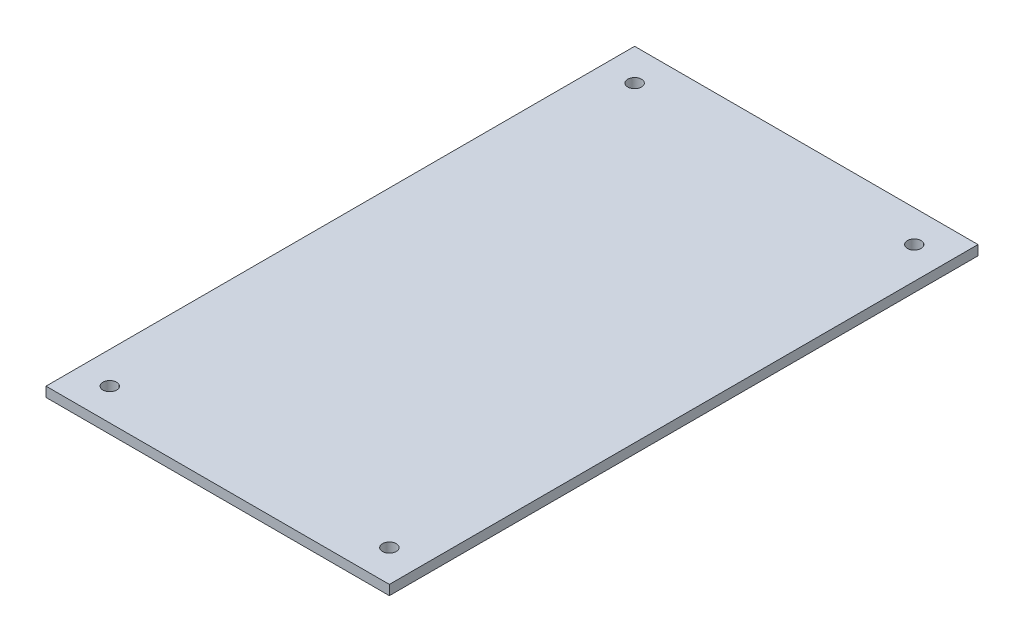
ISO-10303-21;
HEADER;
FILE_DESCRIPTION(('STEP AP214'),'2;1');
FILE_NAME('part.step','',(''),(''),'','','');
FILE_SCHEMA(('AUTOMOTIVE_DESIGN { 1 0 10303 214 1 1 1 1 }'));
ENDSEC;
DATA;
#1=APPLICATION_CONTEXT('core data for automotive mechanical design processes');
#2=APPLICATION_PROTOCOL_DEFINITION('international standard','automotive_design',2000,#1);
#3=PRODUCT_CONTEXT('',#1,'mechanical');
#4=PRODUCT('Part','Part','',(#3));
#5=PRODUCT_RELATED_PRODUCT_CATEGORY('part','',(#4));
#6=PRODUCT_DEFINITION_FORMATION('','',#4);
#7=PRODUCT_DEFINITION_CONTEXT('part definition',#1,'design');
#8=PRODUCT_DEFINITION('design','',#6,#7);
#9=PRODUCT_DEFINITION_SHAPE('','',#8);
#10=(LENGTH_UNIT() NAMED_UNIT(*) SI_UNIT(.MILLI.,.METRE.));
#11=(NAMED_UNIT(*) PLANE_ANGLE_UNIT() SI_UNIT($,.RADIAN.));
#12=(NAMED_UNIT(*) SI_UNIT($,.STERADIAN.) SOLID_ANGLE_UNIT());
#13=UNCERTAINTY_MEASURE_WITH_UNIT(LENGTH_MEASURE(1.E-05),#10,'distance_accuracy_value','');
#14=(GEOMETRIC_REPRESENTATION_CONTEXT(3) GLOBAL_UNCERTAINTY_ASSIGNED_CONTEXT((#13)) GLOBAL_UNIT_ASSIGNED_CONTEXT((#10,
#11,#12)) REPRESENTATION_CONTEXT('',''));
#15=CARTESIAN_POINT('',(0.,0.,0.));
#16=DIRECTION('',(0.,0.,1.));
#17=DIRECTION('',(1.,0.,0.));
#18=AXIS2_PLACEMENT_3D('',#15,#16,#17);
#19=CARTESIAN_POINT('',(-32.,2.,57.));
#20=DIRECTION('',(1.,0.,0.));
#21=DIRECTION('',(0.,0.,-1.));
#22=AXIS2_PLACEMENT_3D('',#19,#20,#21);
#23=PLANE('',#22);
#24=DIRECTION('',(0.,0.,1.));
#25=VECTOR('',#24,1.);
#26=CARTESIAN_POINT('',(-32.,0.,57.));
#27=LINE('',#26,#25);
#28=CARTESIAN_POINT('',(-32.,0.,-57.));
#29=VERTEX_POINT('',#28);
#30=CARTESIAN_POINT('',(-32.,0.,57.));
#31=VERTEX_POINT('',#30);
#32=EDGE_CURVE('E132',#29,#31,#27,.T.);
#33=ORIENTED_EDGE('',*,*,#32,.T.);
#34=DIRECTION('',(0.,-1.,0.));
#35=VECTOR('',#34,1.);
#36=CARTESIAN_POINT('',(-32.,2.,57.));
#37=LINE('',#36,#35);
#38=CARTESIAN_POINT('',(-32.,2.,57.));
#39=VERTEX_POINT('',#38);
#40=EDGE_CURVE('E11',#39,#31,#37,.T.);
#41=ORIENTED_EDGE('',*,*,#40,.F.);
#42=DIRECTION('',(0.,0.,1.));
#43=VECTOR('',#42,1.);
#44=CARTESIAN_POINT('',(-32.,2.,57.));
#45=LINE('',#44,#43);
#46=CARTESIAN_POINT('',(-32.,2.,-57.));
#47=VERTEX_POINT('',#46);
#48=EDGE_CURVE('E141',#47,#39,#45,.T.);
#49=ORIENTED_EDGE('',*,*,#48,.F.);
#50=DIRECTION('',(0.,-1.,0.));
#51=VECTOR('',#50,1.);
#52=CARTESIAN_POINT('',(-32.,2.,-57.));
#53=LINE('',#52,#51);
#54=EDGE_CURVE('E150',#47,#29,#53,.T.);
#55=ORIENTED_EDGE('',*,*,#54,.T.);
#56=EDGE_LOOP('',(#33,#41,#49,#55));
#57=FACE_BOUND('',#56,.T.);
#58=ADVANCED_FACE('F34',(#57),#23,.F.);
#59=CARTESIAN_POINT('',(32.,2.,57.));
#60=DIRECTION('',(0.,0.,-1.));
#61=DIRECTION('',(-1.,0.,0.));
#62=AXIS2_PLACEMENT_3D('',#59,#60,#61);
#63=PLANE('',#62);
#64=DIRECTION('',(1.,0.,0.));
#65=VECTOR('',#64,1.);
#66=CARTESIAN_POINT('',(32.,0.,57.));
#67=LINE('',#66,#65);
#68=CARTESIAN_POINT('',(32.,0.,57.));
#69=VERTEX_POINT('',#68);
#70=EDGE_CURVE('E135',#31,#69,#67,.T.);
#71=ORIENTED_EDGE('',*,*,#70,.T.);
#72=DIRECTION('',(0.,-1.,0.));
#73=VECTOR('',#72,1.);
#74=CARTESIAN_POINT('',(32.,2.,57.));
#75=LINE('',#74,#73);
#76=CARTESIAN_POINT('',(32.,2.,57.));
#77=VERTEX_POINT('',#76);
#78=EDGE_CURVE('E42',#77,#69,#75,.T.);
#79=ORIENTED_EDGE('',*,*,#78,.F.);
#80=DIRECTION('',(1.,0.,0.));
#81=VECTOR('',#80,1.);
#82=CARTESIAN_POINT('',(32.,2.,57.));
#83=LINE('',#82,#81);
#84=EDGE_CURVE('E76',#39,#77,#83,.T.);
#85=ORIENTED_EDGE('',*,*,#84,.F.);
#86=ORIENTED_EDGE('',*,*,#40,.T.);
#87=EDGE_LOOP('',(#71,#79,#85,#86));
#88=FACE_BOUND('',#87,.T.);
#89=ADVANCED_FACE('F177',(#88),#63,.F.);
#90=CARTESIAN_POINT('',(32.,2.,57.));
#91=DIRECTION('',(-1.,0.,0.));
#92=DIRECTION('',(0.,0.,1.));
#93=AXIS2_PLACEMENT_3D('',#90,#91,#92);
#94=PLANE('',#93);
#95=DIRECTION('',(0.,0.,-1.));
#96=VECTOR('',#95,1.);
#97=CARTESIAN_POINT('',(32.,0.,57.));
#98=LINE('',#97,#96);
#99=CARTESIAN_POINT('',(32.,0.,-57.));
#100=VERTEX_POINT('',#99);
#101=EDGE_CURVE('E66',#69,#100,#98,.T.);
#102=ORIENTED_EDGE('',*,*,#101,.T.);
#103=DIRECTION('',(0.,-1.,0.));
#104=VECTOR('',#103,1.);
#105=CARTESIAN_POINT('',(32.,2.,-57.));
#106=LINE('',#105,#104);
#107=CARTESIAN_POINT('',(32.,2.,-57.));
#108=VERTEX_POINT('',#107);
#109=EDGE_CURVE('E50',#108,#100,#106,.T.);
#110=ORIENTED_EDGE('',*,*,#109,.F.);
#111=DIRECTION('',(0.,0.,-1.));
#112=VECTOR('',#111,1.);
#113=CARTESIAN_POINT('',(32.,2.,57.));
#114=LINE('',#113,#112);
#115=EDGE_CURVE('E145',#77,#108,#114,.T.);
#116=ORIENTED_EDGE('',*,*,#115,.F.);
#117=ORIENTED_EDGE('',*,*,#78,.T.);
#118=EDGE_LOOP('',(#102,#110,#116,#117));
#119=FACE_BOUND('',#118,.T.);
#120=ADVANCED_FACE('F156',(#119),#94,.F.);
#121=CARTESIAN_POINT('',(32.,2.,-57.));
#122=DIRECTION('',(0.,0.,1.));
#123=DIRECTION('',(1.,0.,0.));
#124=AXIS2_PLACEMENT_3D('',#121,#122,#123);
#125=PLANE('',#124);
#126=DIRECTION('',(-1.,0.,0.));
#127=VECTOR('',#126,1.);
#128=CARTESIAN_POINT('',(32.,0.,-57.));
#129=LINE('',#128,#127);
#130=EDGE_CURVE('E71',#100,#29,#129,.T.);
#131=ORIENTED_EDGE('',*,*,#130,.T.);
#132=ORIENTED_EDGE('',*,*,#54,.F.);
#133=DIRECTION('',(-1.,0.,0.));
#134=VECTOR('',#133,1.);
#135=CARTESIAN_POINT('',(32.,2.,-57.));
#136=LINE('',#135,#134);
#137=EDGE_CURVE('E148',#108,#47,#136,.T.);
#138=ORIENTED_EDGE('',*,*,#137,.F.);
#139=ORIENTED_EDGE('',*,*,#109,.T.);
#140=EDGE_LOOP('',(#131,#132,#138,#139));
#141=FACE_BOUND('',#140,.T.);
#142=ADVANCED_FACE('F161',(#141),#125,.F.);
#143=CARTESIAN_POINT('',(0.,0.,0.));
#144=DIRECTION('',(0.,1.,0.));
#145=DIRECTION('',(0.,0.,1.));
#146=AXIS2_PLACEMENT_3D('',#143,#144,#145);
#147=PLANE('',#146);
#148=CARTESIAN_POINT('',(28.5,0.,53.5));
#149=DIRECTION('',(0.,1.,0.));
#150=DIRECTION('',(0.,0.,1.));
#151=AXIS2_PLACEMENT_3D('',#148,#149,#150);
#152=CIRCLE('',#151,1.4);
#153=CARTESIAN_POINT('',(28.5,0.,54.9));
#154=VERTEX_POINT('',#153);
#155=EDGE_CURVE('E232',#154,#154,#152,.T.);
#156=ORIENTED_EDGE('',*,*,#155,.T.);
#157=EDGE_LOOP('',(#156));
#158=FACE_BOUND('',#157,.T.);
#159=CARTESIAN_POINT('',(-28.5,0.,53.5));
#160=DIRECTION('',(0.,1.,0.));
#161=DIRECTION('',(0.,0.,1.));
#162=AXIS2_PLACEMENT_3D('',#159,#160,#161);
#163=CIRCLE('',#162,1.4);
#164=CARTESIAN_POINT('',(-28.5,0.,54.9));
#165=VERTEX_POINT('',#164);
#166=EDGE_CURVE('E226',#165,#165,#163,.T.);
#167=ORIENTED_EDGE('',*,*,#166,.T.);
#168=EDGE_LOOP('',(#167));
#169=FACE_BOUND('',#168,.T.);
#170=CARTESIAN_POINT('',(28.5,0.,-53.5));
#171=DIRECTION('',(0.,1.,0.));
#172=DIRECTION('',(0.,0.,1.));
#173=AXIS2_PLACEMENT_3D('',#170,#171,#172);
#174=CIRCLE('',#173,1.4);
#175=CARTESIAN_POINT('',(28.5,0.,-52.1));
#176=VERTEX_POINT('',#175);
#177=EDGE_CURVE('E221',#176,#176,#174,.T.);
#178=ORIENTED_EDGE('',*,*,#177,.T.);
#179=EDGE_LOOP('',(#178));
#180=FACE_BOUND('',#179,.T.);
#181=CARTESIAN_POINT('',(-28.5,0.,-53.5));
#182=DIRECTION('',(0.,1.,0.));
#183=DIRECTION('',(0.,0.,1.));
#184=AXIS2_PLACEMENT_3D('',#181,#182,#183);
#185=CIRCLE('',#184,1.4);
#186=CARTESIAN_POINT('',(-28.5,0.,-52.1));
#187=VERTEX_POINT('',#186);
#188=EDGE_CURVE('E210',#187,#187,#185,.T.);
#189=ORIENTED_EDGE('',*,*,#188,.T.);
#190=EDGE_LOOP('',(#189));
#191=FACE_BOUND('',#190,.T.);
#192=ORIENTED_EDGE('',*,*,#32,.F.);
#193=ORIENTED_EDGE('',*,*,#130,.F.);
#194=ORIENTED_EDGE('',*,*,#101,.F.);
#195=ORIENTED_EDGE('',*,*,#70,.F.);
#196=EDGE_LOOP('',(#192,#193,#194,#195));
#197=FACE_BOUND('',#196,.T.);
#198=ADVANCED_FACE('F159',(#158,#169,#180,#191,#197),#147,.F.);
#199=CARTESIAN_POINT('',(0.,2.,0.));
#200=DIRECTION('',(0.,1.,0.));
#201=DIRECTION('',(0.,0.,1.));
#202=AXIS2_PLACEMENT_3D('',#199,#200,#201);
#203=PLANE('',#202);
#204=DIRECTION('',(0.,0.,1.));
#205=VECTOR('',#204,1.);
#206=CARTESIAN_POINT('',(-35.,2.,60.));
#207=LINE('',#206,#205);
#208=CARTESIAN_POINT('',(-35.,2.,-60.));
#209=VERTEX_POINT('',#208);
#210=CARTESIAN_POINT('',(-35.,2.,60.));
#211=VERTEX_POINT('',#210);
#212=EDGE_CURVE('E131',#209,#211,#207,.T.);
#213=ORIENTED_EDGE('',*,*,#212,.F.);
#214=DIRECTION('',(-1.,0.,0.));
#215=VECTOR('',#214,1.);
#216=CARTESIAN_POINT('',(35.,2.,-60.));
#217=LINE('',#216,#215);
#218=CARTESIAN_POINT('',(35.,2.,-60.));
#219=VERTEX_POINT('',#218);
#220=EDGE_CURVE('E127',#219,#209,#217,.T.);
#221=ORIENTED_EDGE('',*,*,#220,.F.);
#222=DIRECTION('',(0.,0.,-1.));
#223=VECTOR('',#222,1.);
#224=CARTESIAN_POINT('',(35.,2.,60.));
#225=LINE('',#224,#223);
#226=CARTESIAN_POINT('',(35.,2.,60.));
#227=VERTEX_POINT('',#226);
#228=EDGE_CURVE('E206',#227,#219,#225,.T.);
#229=ORIENTED_EDGE('',*,*,#228,.F.);
#230=DIRECTION('',(1.,0.,0.));
#231=VECTOR('',#230,1.);
#232=CARTESIAN_POINT('',(35.,2.,60.));
#233=LINE('',#232,#231);
#234=EDGE_CURVE('E209',#211,#227,#233,.T.);
#235=ORIENTED_EDGE('',*,*,#234,.F.);
#236=EDGE_LOOP('',(#213,#221,#229,#235));
#237=FACE_BOUND('',#236,.T.);
#238=ORIENTED_EDGE('',*,*,#137,.T.);
#239=ORIENTED_EDGE('',*,*,#48,.T.);
#240=ORIENTED_EDGE('',*,*,#84,.T.);
#241=ORIENTED_EDGE('',*,*,#115,.T.);
#242=EDGE_LOOP('',(#238,#239,#240,#241));
#243=FACE_BOUND('',#242,.T.);
#244=ADVANCED_FACE('F163',(#237,#243),#203,.F.);
#245=CARTESIAN_POINT('',(-35.,4.,60.));
#246=DIRECTION('',(1.,0.,0.));
#247=DIRECTION('',(0.,0.,-1.));
#248=AXIS2_PLACEMENT_3D('',#245,#246,#247);
#249=PLANE('',#248);
#250=ORIENTED_EDGE('',*,*,#212,.T.);
#251=DIRECTION('',(0.,-1.,0.));
#252=VECTOR('',#251,1.);
#253=CARTESIAN_POINT('',(-35.,4.,60.));
#254=LINE('',#253,#252);
#255=CARTESIAN_POINT('',(-35.,4.,60.));
#256=VERTEX_POINT('',#255);
#257=EDGE_CURVE('E111',#256,#211,#254,.T.);
#258=ORIENTED_EDGE('',*,*,#257,.F.);
#259=DIRECTION('',(0.,0.,1.));
#260=VECTOR('',#259,1.);
#261=CARTESIAN_POINT('',(-35.,4.,60.));
#262=LINE('',#261,#260);
#263=CARTESIAN_POINT('',(-35.,4.,-60.));
#264=VERTEX_POINT('',#263);
#265=EDGE_CURVE('E118',#264,#256,#262,.T.);
#266=ORIENTED_EDGE('',*,*,#265,.F.);
#267=DIRECTION('',(0.,-1.,0.));
#268=VECTOR('',#267,1.);
#269=CARTESIAN_POINT('',(-35.,4.,-60.));
#270=LINE('',#269,#268);
#271=EDGE_CURVE('E203',#264,#209,#270,.T.);
#272=ORIENTED_EDGE('',*,*,#271,.T.);
#273=EDGE_LOOP('',(#250,#258,#266,#272));
#274=FACE_BOUND('',#273,.T.);
#275=ADVANCED_FACE('F129',(#274),#249,.F.);
#276=CARTESIAN_POINT('',(35.,4.,60.));
#277=DIRECTION('',(0.,0.,-1.));
#278=DIRECTION('',(-1.,0.,0.));
#279=AXIS2_PLACEMENT_3D('',#276,#277,#278);
#280=PLANE('',#279);
#281=ORIENTED_EDGE('',*,*,#234,.T.);
#282=DIRECTION('',(0.,-1.,0.));
#283=VECTOR('',#282,1.);
#284=CARTESIAN_POINT('',(35.,4.,60.));
#285=LINE('',#284,#283);
#286=CARTESIAN_POINT('',(35.,4.,60.));
#287=VERTEX_POINT('',#286);
#288=EDGE_CURVE('E114',#287,#227,#285,.T.);
#289=ORIENTED_EDGE('',*,*,#288,.F.);
#290=DIRECTION('',(1.,0.,0.));
#291=VECTOR('',#290,1.);
#292=CARTESIAN_POINT('',(35.,4.,60.));
#293=LINE('',#292,#291);
#294=EDGE_CURVE('E107',#256,#287,#293,.T.);
#295=ORIENTED_EDGE('',*,*,#294,.F.);
#296=ORIENTED_EDGE('',*,*,#257,.T.);
#297=EDGE_LOOP('',(#281,#289,#295,#296));
#298=FACE_BOUND('',#297,.T.);
#299=ADVANCED_FACE('F109',(#298),#280,.F.);
#300=CARTESIAN_POINT('',(35.,4.,60.));
#301=DIRECTION('',(-1.,0.,0.));
#302=DIRECTION('',(0.,0.,1.));
#303=AXIS2_PLACEMENT_3D('',#300,#301,#302);
#304=PLANE('',#303);
#305=ORIENTED_EDGE('',*,*,#228,.T.);
#306=DIRECTION('',(0.,-1.,0.));
#307=VECTOR('',#306,1.);
#308=CARTESIAN_POINT('',(35.,4.,-60.));
#309=LINE('',#308,#307);
#310=CARTESIAN_POINT('',(35.,4.,-60.));
#311=VERTEX_POINT('',#310);
#312=EDGE_CURVE('E137',#311,#219,#309,.T.);
#313=ORIENTED_EDGE('',*,*,#312,.F.);
#314=DIRECTION('',(0.,0.,-1.));
#315=VECTOR('',#314,1.);
#316=CARTESIAN_POINT('',(35.,4.,60.));
#317=LINE('',#316,#315);
#318=EDGE_CURVE('E117',#287,#311,#317,.T.);
#319=ORIENTED_EDGE('',*,*,#318,.F.);
#320=ORIENTED_EDGE('',*,*,#288,.T.);
#321=EDGE_LOOP('',(#305,#313,#319,#320));
#322=FACE_BOUND('',#321,.T.);
#323=ADVANCED_FACE('F190',(#322),#304,.F.);
#324=CARTESIAN_POINT('',(35.,4.,-60.));
#325=DIRECTION('',(0.,0.,1.));
#326=DIRECTION('',(1.,0.,0.));
#327=AXIS2_PLACEMENT_3D('',#324,#325,#326);
#328=PLANE('',#327);
#329=ORIENTED_EDGE('',*,*,#220,.T.);
#330=ORIENTED_EDGE('',*,*,#271,.F.);
#331=DIRECTION('',(-1.,0.,0.));
#332=VECTOR('',#331,1.);
#333=CARTESIAN_POINT('',(35.,4.,-60.));
#334=LINE('',#333,#332);
#335=EDGE_CURVE('E123',#311,#264,#334,.T.);
#336=ORIENTED_EDGE('',*,*,#335,.F.);
#337=ORIENTED_EDGE('',*,*,#312,.T.);
#338=EDGE_LOOP('',(#329,#330,#336,#337));
#339=FACE_BOUND('',#338,.T.);
#340=ADVANCED_FACE('F192',(#339),#328,.F.);
#341=CARTESIAN_POINT('',(0.,4.,0.));
#342=DIRECTION('',(0.,1.,0.));
#343=DIRECTION('',(0.,0.,1.));
#344=AXIS2_PLACEMENT_3D('',#341,#342,#343);
#345=PLANE('',#344);
#346=CARTESIAN_POINT('',(28.5,4.,53.5));
#347=DIRECTION('',(0.,1.,0.));
#348=DIRECTION('',(0.,0.,1.));
#349=AXIS2_PLACEMENT_3D('',#346,#347,#348);
#350=CIRCLE('',#349,1.4);
#351=CARTESIAN_POINT('',(28.5,4.,54.9));
#352=VERTEX_POINT('',#351);
#353=EDGE_CURVE('E235',#352,#352,#350,.T.);
#354=ORIENTED_EDGE('',*,*,#353,.F.);
#355=EDGE_LOOP('',(#354));
#356=FACE_BOUND('',#355,.T.);
#357=CARTESIAN_POINT('',(-28.5,4.,53.5));
#358=DIRECTION('',(0.,1.,0.));
#359=DIRECTION('',(0.,0.,1.));
#360=AXIS2_PLACEMENT_3D('',#357,#358,#359);
#361=CIRCLE('',#360,1.4);
#362=CARTESIAN_POINT('',(-28.5,4.,54.9));
#363=VERTEX_POINT('',#362);
#364=EDGE_CURVE('E229',#363,#363,#361,.T.);
#365=ORIENTED_EDGE('',*,*,#364,.F.);
#366=EDGE_LOOP('',(#365));
#367=FACE_BOUND('',#366,.T.);
#368=CARTESIAN_POINT('',(28.5,4.,-53.5));
#369=DIRECTION('',(0.,1.,0.));
#370=DIRECTION('',(0.,0.,1.));
#371=AXIS2_PLACEMENT_3D('',#368,#369,#370);
#372=CIRCLE('',#371,1.4);
#373=CARTESIAN_POINT('',(28.5,4.,-52.1));
#374=VERTEX_POINT('',#373);
#375=EDGE_CURVE('E223',#374,#374,#372,.T.);
#376=ORIENTED_EDGE('',*,*,#375,.F.);
#377=EDGE_LOOP('',(#376));
#378=FACE_BOUND('',#377,.T.);
#379=CARTESIAN_POINT('',(-28.5,4.,-53.5));
#380=DIRECTION('',(0.,1.,0.));
#381=DIRECTION('',(0.,0.,1.));
#382=AXIS2_PLACEMENT_3D('',#379,#380,#381);
#383=CIRCLE('',#382,1.4);
#384=CARTESIAN_POINT('',(-28.5,4.,-52.1));
#385=VERTEX_POINT('',#384);
#386=EDGE_CURVE('E214',#385,#385,#383,.T.);
#387=ORIENTED_EDGE('',*,*,#386,.F.);
#388=EDGE_LOOP('',(#387));
#389=FACE_BOUND('',#388,.T.);
#390=ORIENTED_EDGE('',*,*,#265,.T.);
#391=ORIENTED_EDGE('',*,*,#294,.T.);
#392=ORIENTED_EDGE('',*,*,#318,.T.);
#393=ORIENTED_EDGE('',*,*,#335,.T.);
#394=EDGE_LOOP('',(#390,#391,#392,#393));
#395=FACE_BOUND('',#394,.T.);
#396=ADVANCED_FACE('F121',(#356,#367,#378,#389,#395),#345,.T.);
#397=CARTESIAN_POINT('',(-28.5,0.,-53.5));
#398=DIRECTION('',(0.,1.,0.));
#399=DIRECTION('',(0.,0.,1.));
#400=AXIS2_PLACEMENT_3D('',#397,#398,#399);
#401=CYLINDRICAL_SURFACE('',#400,1.4);
#402=ORIENTED_EDGE('',*,*,#188,.F.);
#403=EDGE_LOOP('',(#402));
#404=FACE_BOUND('',#403,.T.);
#405=ORIENTED_EDGE('',*,*,#386,.T.);
#406=EDGE_LOOP('',(#405));
#407=FACE_BOUND('',#406,.T.);
#408=ADVANCED_FACE('F199',(#404,#407),#401,.F.);
#409=CARTESIAN_POINT('',(28.5,0.,-53.5));
#410=DIRECTION('',(0.,1.,0.));
#411=DIRECTION('',(0.,0.,1.));
#412=AXIS2_PLACEMENT_3D('',#409,#410,#411);
#413=CYLINDRICAL_SURFACE('',#412,1.4);
#414=ORIENTED_EDGE('',*,*,#177,.F.);
#415=EDGE_LOOP('',(#414));
#416=FACE_BOUND('',#415,.T.);
#417=ORIENTED_EDGE('',*,*,#375,.T.);
#418=EDGE_LOOP('',(#417));
#419=FACE_BOUND('',#418,.T.);
#420=ADVANCED_FACE('F256',(#416,#419),#413,.F.);
#421=CARTESIAN_POINT('',(-28.5,0.,53.5));
#422=DIRECTION('',(0.,1.,0.));
#423=DIRECTION('',(0.,0.,1.));
#424=AXIS2_PLACEMENT_3D('',#421,#422,#423);
#425=CYLINDRICAL_SURFACE('',#424,1.4);
#426=ORIENTED_EDGE('',*,*,#166,.F.);
#427=EDGE_LOOP('',(#426));
#428=FACE_BOUND('',#427,.T.);
#429=ORIENTED_EDGE('',*,*,#364,.T.);
#430=EDGE_LOOP('',(#429));
#431=FACE_BOUND('',#430,.T.);
#432=ADVANCED_FACE('F245',(#428,#431),#425,.F.);
#433=CARTESIAN_POINT('',(28.5,0.,53.5));
#434=DIRECTION('',(0.,1.,0.));
#435=DIRECTION('',(0.,0.,1.));
#436=AXIS2_PLACEMENT_3D('',#433,#434,#435);
#437=CYLINDRICAL_SURFACE('',#436,1.4);
#438=ORIENTED_EDGE('',*,*,#155,.F.);
#439=EDGE_LOOP('',(#438));
#440=FACE_BOUND('',#439,.T.);
#441=ORIENTED_EDGE('',*,*,#353,.T.);
#442=EDGE_LOOP('',(#441));
#443=FACE_BOUND('',#442,.T.);
#444=ADVANCED_FACE('F242',(#440,#443),#437,.F.);
#445=CLOSED_SHELL('',(#58,#89,#120,#142,#198,#244,#275,#299,#323,#340,#396,#408,#420,#432,#444));
#446=MANIFOLD_SOLID_BREP('B2',#445);
#447=ADVANCED_BREP_SHAPE_REPRESENTATION('',(#18,#446),#14);
#448=SHAPE_DEFINITION_REPRESENTATION(#9,#447);
ENDSEC;
END-ISO-10303-21;
